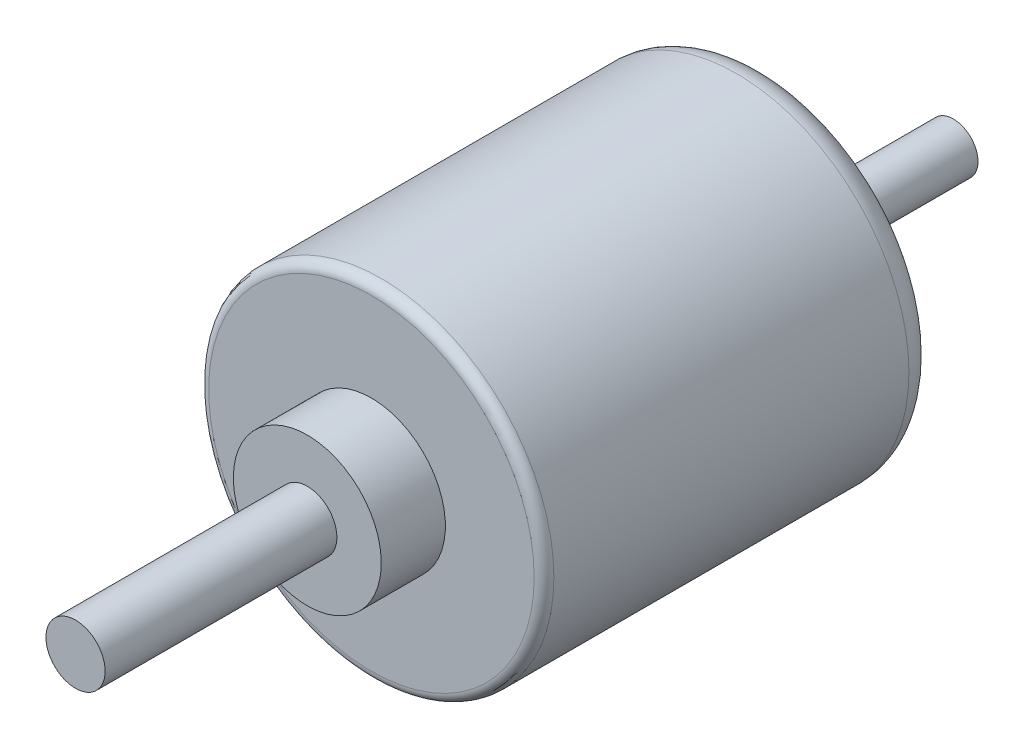
ISO-10303-21;
HEADER;
FILE_DESCRIPTION(('STEP AP214'),'2;1');
FILE_NAME('part.step','',(''),(''),'','','');
FILE_SCHEMA(('AUTOMOTIVE_DESIGN { 1 0 10303 214 1 1 1 1 }'));
ENDSEC;
DATA;
#1=APPLICATION_CONTEXT('core data for automotive mechanical design processes');
#2=APPLICATION_PROTOCOL_DEFINITION('international standard','automotive_design',2000,#1);
#3=PRODUCT_CONTEXT('',#1,'mechanical');
#4=PRODUCT('Part','Part','',(#3));
#5=PRODUCT_RELATED_PRODUCT_CATEGORY('part','',(#4));
#6=PRODUCT_DEFINITION_FORMATION('','',#4);
#7=PRODUCT_DEFINITION_CONTEXT('part definition',#1,'design');
#8=PRODUCT_DEFINITION('design','',#6,#7);
#9=PRODUCT_DEFINITION_SHAPE('','',#8);
#10=(LENGTH_UNIT() NAMED_UNIT(*) SI_UNIT(.MILLI.,.METRE.));
#11=(NAMED_UNIT(*) PLANE_ANGLE_UNIT() SI_UNIT($,.RADIAN.));
#12=(NAMED_UNIT(*) SI_UNIT($,.STERADIAN.) SOLID_ANGLE_UNIT());
#13=UNCERTAINTY_MEASURE_WITH_UNIT(LENGTH_MEASURE(1.E-05),#10,'distance_accuracy_value','');
#14=(GEOMETRIC_REPRESENTATION_CONTEXT(3) GLOBAL_UNCERTAINTY_ASSIGNED_CONTEXT((#13)) GLOBAL_UNIT_ASSIGNED_CONTEXT((#10,
#11,#12)) REPRESENTATION_CONTEXT('',''));
#15=CARTESIAN_POINT('',(0.,0.,0.));
#16=DIRECTION('',(0.,0.,1.));
#17=DIRECTION('',(1.,0.,0.));
#18=AXIS2_PLACEMENT_3D('',#15,#16,#17);
#19=CARTESIAN_POINT('',(0.,0.,40.));
#20=DIRECTION('',(0.,0.,-1.));
#21=DIRECTION('',(-1.,0.,0.));
#22=AXIS2_PLACEMENT_3D('',#19,#20,#21);
#23=CYLINDRICAL_SURFACE('',#22,17.5);
#24=CARTESIAN_POINT('',(0.,0.,3.));
#25=DIRECTION('',(0.,0.,1.));
#26=DIRECTION('',(1.,0.,0.));
#27=AXIS2_PLACEMENT_3D('',#24,#25,#26);
#28=CIRCLE('',#27,17.5);
#29=CARTESIAN_POINT('',(17.5,0.,3.));
#30=VERTEX_POINT('',#29);
#31=EDGE_CURVE('E39',#30,#30,#28,.T.);
#32=ORIENTED_EDGE('',*,*,#31,.T.);
#33=EDGE_LOOP('',(#32));
#34=FACE_BOUND('',#33,.T.);
#35=CARTESIAN_POINT('',(0.,0.,39.));
#36=DIRECTION('',(0.,0.,1.));
#37=DIRECTION('',(1.,0.,0.));
#38=AXIS2_PLACEMENT_3D('',#35,#36,#37);
#39=CIRCLE('',#38,17.5);
#40=CARTESIAN_POINT('',(17.5,0.,39.));
#41=VERTEX_POINT('',#40);
#42=EDGE_CURVE('E43',#41,#41,#39,.F.);
#43=ORIENTED_EDGE('',*,*,#42,.T.);
#44=EDGE_LOOP('',(#43));
#45=FACE_BOUND('',#44,.T.);
#46=ADVANCED_FACE('F32',(#34,#45),#23,.T.);
#47=CARTESIAN_POINT('',(0.,0.,40.));
#48=DIRECTION('',(0.,0.,1.));
#49=DIRECTION('',(1.,0.,0.));
#50=AXIS2_PLACEMENT_3D('',#47,#48,#49);
#51=PLANE('',#50);
#52=CARTESIAN_POINT('',(0.,0.,40.));
#53=DIRECTION('',(0.,0.,1.));
#54=DIRECTION('',(1.,0.,0.));
#55=AXIS2_PLACEMENT_3D('',#52,#53,#54);
#56=CIRCLE('',#55,16.5);
#57=CARTESIAN_POINT('',(16.5,0.,40.));
#58=VERTEX_POINT('',#57);
#59=EDGE_CURVE('E47',#58,#58,#56,.T.);
#60=ORIENTED_EDGE('',*,*,#59,.T.);
#61=EDGE_LOOP('',(#60));
#62=FACE_BOUND('',#61,.T.);
#63=CARTESIAN_POINT('',(0.,0.,40.));
#64=DIRECTION('',(0.,0.,1.));
#65=DIRECTION('',(1.,0.,0.));
#66=AXIS2_PLACEMENT_3D('',#63,#64,#65);
#67=CIRCLE('',#66,7.5);
#68=CARTESIAN_POINT('',(-7.5,0.,40.));
#69=VERTEX_POINT('',#68);
#70=EDGE_CURVE('E56',#69,#69,#67,.F.);
#71=ORIENTED_EDGE('',*,*,#70,.T.);
#72=EDGE_LOOP('',(#71));
#73=FACE_BOUND('',#72,.T.);
#74=ADVANCED_FACE('F91',(#62,#73),#51,.T.);
#75=CARTESIAN_POINT('',(0.,0.,0.));
#76=DIRECTION('',(0.,0.,1.));
#77=DIRECTION('',(1.,0.,0.));
#78=AXIS2_PLACEMENT_3D('',#75,#76,#77);
#79=PLANE('',#78);
#80=CARTESIAN_POINT('',(0.,0.,0.));
#81=DIRECTION('',(0.,0.,1.));
#82=DIRECTION('',(1.,0.,0.));
#83=AXIS2_PLACEMENT_3D('',#80,#81,#82);
#84=CIRCLE('',#83,14.5);
#85=CARTESIAN_POINT('',(14.5,0.,0.));
#86=VERTEX_POINT('',#85);
#87=EDGE_CURVE('E10',#86,#86,#84,.F.);
#88=ORIENTED_EDGE('',*,*,#87,.T.);
#89=EDGE_LOOP('',(#88));
#90=FACE_BOUND('',#89,.T.);
#91=CARTESIAN_POINT('',(0.,0.,0.));
#92=DIRECTION('',(0.,0.,1.));
#93=DIRECTION('',(1.,0.,0.));
#94=AXIS2_PLACEMENT_3D('',#91,#92,#93);
#95=CIRCLE('',#94,2.5);
#96=CARTESIAN_POINT('',(2.5,0.,0.));
#97=VERTEX_POINT('',#96);
#98=EDGE_CURVE('E58',#97,#97,#95,.T.);
#99=ORIENTED_EDGE('',*,*,#98,.T.);
#100=EDGE_LOOP('',(#99));
#101=FACE_BOUND('',#100,.T.);
#102=ADVANCED_FACE('F96',(#90,#101),#79,.F.);
#103=CARTESIAN_POINT('',(0.,0.,-19.));
#104=DIRECTION('',(0.,0.,1.));
#105=DIRECTION('',(1.,0.,0.));
#106=AXIS2_PLACEMENT_3D('',#103,#104,#105);
#107=CYLINDRICAL_SURFACE('',#106,2.5);
#108=CARTESIAN_POINT('',(0.,0.,-19.));
#109=DIRECTION('',(0.,0.,1.));
#110=DIRECTION('',(1.,0.,0.));
#111=AXIS2_PLACEMENT_3D('',#108,#109,#110);
#112=CIRCLE('',#111,2.5);
#113=CARTESIAN_POINT('',(2.5,0.,-19.));
#114=VERTEX_POINT('',#113);
#115=EDGE_CURVE('E52',#114,#114,#112,.T.);
#116=ORIENTED_EDGE('',*,*,#115,.T.);
#117=EDGE_LOOP('',(#116));
#118=FACE_BOUND('',#117,.T.);
#119=ORIENTED_EDGE('',*,*,#98,.F.);
#120=EDGE_LOOP('',(#119));
#121=FACE_BOUND('',#120,.T.);
#122=ADVANCED_FACE('F85',(#118,#121),#107,.T.);
#123=CARTESIAN_POINT('',(0.,0.,-19.));
#124=DIRECTION('',(0.,0.,1.));
#125=DIRECTION('',(1.,0.,0.));
#126=AXIS2_PLACEMENT_3D('',#123,#124,#125);
#127=PLANE('',#126);
#128=ORIENTED_EDGE('',*,*,#115,.F.);
#129=EDGE_LOOP('',(#128));
#130=FACE_BOUND('',#129,.T.);
#131=ADVANCED_FACE('F75',(#130),#127,.F.);
#132=CARTESIAN_POINT('',(0.,0.,46.5));
#133=DIRECTION('',(0.,0.,-1.));
#134=DIRECTION('',(-1.,0.,0.));
#135=AXIS2_PLACEMENT_3D('',#132,#133,#134);
#136=CYLINDRICAL_SURFACE('',#135,7.5);
#137=CARTESIAN_POINT('',(0.,0.,46.5));
#138=DIRECTION('',(0.,0.,1.));
#139=DIRECTION('',(1.,0.,0.));
#140=AXIS2_PLACEMENT_3D('',#137,#138,#139);
#141=CIRCLE('',#140,7.5);
#142=CARTESIAN_POINT('',(-7.5,0.,46.5));
#143=VERTEX_POINT('',#142);
#144=EDGE_CURVE('E57',#143,#143,#141,.T.);
#145=CARTESIAN_POINT('',(-7.5,0.,40.));
#146=CARTESIAN_POINT('',(-7.5,0.,40.0677083333333));
#147=CARTESIAN_POINT('',(-7.5,0.,40.1354166666667));
#148=CARTESIAN_POINT('',(-7.5,0.,40.2708333333333));
#149=CARTESIAN_POINT('',(-7.5,0.,40.3385416666667));
#150=CARTESIAN_POINT('',(-7.5,0.,40.4739583333333));
#151=CARTESIAN_POINT('',(-7.5,0.,40.5416666666667));
#152=CARTESIAN_POINT('',(-7.5,0.,40.6770833333333));
#153=CARTESIAN_POINT('',(-7.5,0.,40.7447916666667));
#154=CARTESIAN_POINT('',(-7.5,0.,40.8802083333333));
#155=CARTESIAN_POINT('',(-7.5,0.,40.9479166666667));
#156=CARTESIAN_POINT('',(-7.5,0.,41.0833333333333));
#157=CARTESIAN_POINT('',(-7.5,0.,41.1510416666667));
#158=CARTESIAN_POINT('',(-7.5,0.,41.2864583333333));
#159=CARTESIAN_POINT('',(-7.5,0.,41.3541666666667));
#160=CARTESIAN_POINT('',(-7.5,0.,41.4895833333333));
#161=CARTESIAN_POINT('',(-7.5,0.,41.5572916666667));
#162=CARTESIAN_POINT('',(-7.5,0.,41.6927083333333));
#163=CARTESIAN_POINT('',(-7.5,0.,41.7604166666667));
#164=CARTESIAN_POINT('',(-7.5,0.,41.8958333333333));
#165=CARTESIAN_POINT('',(-7.5,0.,41.9635416666667));
#166=CARTESIAN_POINT('',(-7.5,0.,42.0989583333333));
#167=CARTESIAN_POINT('',(-7.5,0.,42.1666666666667));
#168=CARTESIAN_POINT('',(-7.5,0.,42.3020833333333));
#169=CARTESIAN_POINT('',(-7.5,0.,42.3697916666667));
#170=CARTESIAN_POINT('',(-7.5,0.,42.5052083333333));
#171=CARTESIAN_POINT('',(-7.5,0.,42.5729166666667));
#172=CARTESIAN_POINT('',(-7.5,0.,42.7083333333333));
#173=CARTESIAN_POINT('',(-7.5,0.,42.7760416666667));
#174=CARTESIAN_POINT('',(-7.5,0.,42.9114583333333));
#175=CARTESIAN_POINT('',(-7.5,0.,42.9791666666667));
#176=CARTESIAN_POINT('',(-7.5,0.,43.1145833333333));
#177=CARTESIAN_POINT('',(-7.5,0.,43.1822916666667));
#178=CARTESIAN_POINT('',(-7.5,0.,43.3177083333333));
#179=CARTESIAN_POINT('',(-7.5,0.,43.3854166666667));
#180=CARTESIAN_POINT('',(-7.5,0.,43.5208333333333));
#181=CARTESIAN_POINT('',(-7.5,0.,43.5885416666667));
#182=CARTESIAN_POINT('',(-7.5,0.,43.7239583333333));
#183=CARTESIAN_POINT('',(-7.5,0.,43.7916666666667));
#184=CARTESIAN_POINT('',(-7.5,0.,43.9270833333333));
#185=CARTESIAN_POINT('',(-7.5,0.,43.9947916666667));
#186=CARTESIAN_POINT('',(-7.5,0.,44.1302083333333));
#187=CARTESIAN_POINT('',(-7.5,0.,44.1979166666667));
#188=CARTESIAN_POINT('',(-7.5,0.,44.3333333333333));
#189=CARTESIAN_POINT('',(-7.5,0.,44.4010416666667));
#190=CARTESIAN_POINT('',(-7.5,0.,44.5364583333333));
#191=CARTESIAN_POINT('',(-7.5,0.,44.6041666666667));
#192=CARTESIAN_POINT('',(-7.5,0.,44.7395833333333));
#193=CARTESIAN_POINT('',(-7.5,0.,44.8072916666667));
#194=CARTESIAN_POINT('',(-7.5,0.,44.9427083333333));
#195=CARTESIAN_POINT('',(-7.5,0.,45.0104166666667));
#196=CARTESIAN_POINT('',(-7.5,0.,45.1458333333333));
#197=CARTESIAN_POINT('',(-7.5,0.,45.2135416666667));
#198=CARTESIAN_POINT('',(-7.5,0.,45.3489583333333));
#199=CARTESIAN_POINT('',(-7.5,0.,45.4166666666667));
#200=CARTESIAN_POINT('',(-7.5,0.,45.5520833333333));
#201=CARTESIAN_POINT('',(-7.5,0.,45.6197916666667));
#202=CARTESIAN_POINT('',(-7.5,0.,45.7552083333333));
#203=CARTESIAN_POINT('',(-7.5,0.,45.8229166666667));
#204=CARTESIAN_POINT('',(-7.5,0.,45.9583333333333));
#205=CARTESIAN_POINT('',(-7.5,0.,46.0260416666667));
#206=CARTESIAN_POINT('',(-7.5,0.,46.1614583333333));
#207=CARTESIAN_POINT('',(-7.5,0.,46.2291666666667));
#208=CARTESIAN_POINT('',(-7.5,0.,46.3645833333333));
#209=CARTESIAN_POINT('',(-7.5,0.,46.4322916666667));
#210=CARTESIAN_POINT('',(-7.5,0.,46.5));
#211=B_SPLINE_CURVE_WITH_KNOTS('',3,(#145,#146,#147,#148,#149,#150,#151,#152,#153,#154,#155,
#156,#157,#158,#159,#160,#161,#162,#163,#164,#165,#166,#167,#168,#169,#170,#171,#172,#173,#174,
#175,#176,#177,#178,#179,#180,#181,#182,#183,#184,#185,#186,#187,#188,#189,#190,#191,#192,#193,
#194,#195,#196,#197,#198,#199,#200,#201,#202,#203,#204,#205,#206,#207,#208,#209,#210),
.UNSPECIFIED.,.F.,.F.,(4,2,2,2,2,2,2,2,2,2,2,2,2,2,2,2,2,2,2,2,2,2,2,2,2,2,2,2,2,2,2,2,4),(0.,
0.203124999999998,0.406249999999997,0.609374999999995,0.812500000000001,1.015625,1.21875,
1.421875,1.62499999999999,1.828125,2.03125,2.234375,2.4375,2.64062499999999,2.84375,3.046875,
3.25,3.45312499999999,3.65624999999999,3.859375,4.0625,4.26562499999999,4.46874999999999,
4.671875,4.875,5.078125,5.28124999999999,5.48437499999999,5.6875,5.890625,6.09374999999999,
6.29687499999999,6.5),.UNSPECIFIED.);
#212=EDGE_CURVE('BSEAM73',#69,#143,#211,.T.);
#213=ORIENTED_EDGE('',*,*,#70,.F.);
#214=ORIENTED_EDGE('',*,*,#144,.F.);
#215=ORIENTED_EDGE('',*,*,#212,.T.);
#216=ORIENTED_EDGE('',*,*,#212,.F.);
#217=EDGE_LOOP('',(#213,#215,#214,#216));
#218=FACE_BOUND('',#217,.T.);
#219=ADVANCED_FACE('F73',(#218),#136,.T.);
#220=CARTESIAN_POINT('',(0.,0.,46.5));
#221=DIRECTION('',(0.,0.,1.));
#222=DIRECTION('',(1.,0.,0.));
#223=AXIS2_PLACEMENT_3D('',#220,#221,#222);
#224=PLANE('',#223);
#225=CARTESIAN_POINT('',(0.,0.,46.5));
#226=DIRECTION('',(0.,0.,1.));
#227=DIRECTION('',(1.,0.,0.));
#228=AXIS2_PLACEMENT_3D('',#225,#226,#227);
#229=CIRCLE('',#228,3.);
#230=CARTESIAN_POINT('',(3.,0.,46.5));
#231=VERTEX_POINT('',#230);
#232=EDGE_CURVE('E53',#231,#231,#229,.T.);
#233=ORIENTED_EDGE('',*,*,#232,.F.);
#234=EDGE_LOOP('',(#233));
#235=FACE_BOUND('',#234,.T.);
#236=ORIENTED_EDGE('',*,*,#144,.T.);
#237=EDGE_LOOP('',(#236));
#238=FACE_BOUND('',#237,.T.);
#239=ADVANCED_FACE('F71',(#235,#238),#224,.T.);
#240=CARTESIAN_POINT('',(0.,0.,70.));
#241=DIRECTION('',(0.,0.,1.));
#242=DIRECTION('',(1.,0.,0.));
#243=AXIS2_PLACEMENT_3D('',#240,#241,#242);
#244=PLANE('',#243);
#245=CARTESIAN_POINT('',(0.,0.,70.));
#246=DIRECTION('',(0.,0.,1.));
#247=DIRECTION('',(1.,0.,0.));
#248=AXIS2_PLACEMENT_3D('',#245,#246,#247);
#249=CIRCLE('',#248,3.);
#250=CARTESIAN_POINT('',(3.,0.,70.));
#251=VERTEX_POINT('',#250);
#252=EDGE_CURVE('E61',#251,#251,#249,.T.);
#253=ORIENTED_EDGE('',*,*,#252,.T.);
#254=EDGE_LOOP('',(#253));
#255=FACE_BOUND('',#254,.T.);
#256=ADVANCED_FACE('F82',(#255),#244,.T.);
#257=CARTESIAN_POINT('',(0.,0.,70.));
#258=DIRECTION('',(0.,0.,-1.));
#259=DIRECTION('',(-1.,0.,0.));
#260=AXIS2_PLACEMENT_3D('',#257,#258,#259);
#261=CYLINDRICAL_SURFACE('',#260,3.);
#262=ORIENTED_EDGE('',*,*,#232,.T.);
#263=EDGE_LOOP('',(#262));
#264=FACE_BOUND('',#263,.T.);
#265=ORIENTED_EDGE('',*,*,#252,.F.);
#266=EDGE_LOOP('',(#265));
#267=FACE_BOUND('',#266,.T.);
#268=ADVANCED_FACE('F103',(#264,#267),#261,.T.);
#269=CARTESIAN_POINT('',(0.,0.,39.));
#270=DIRECTION('',(0.,0.,1.));
#271=DIRECTION('',(1.,0.,0.));
#272=AXIS2_PLACEMENT_3D('',#269,#270,#271);
#273=TOROIDAL_SURFACE('',#272,16.5,1.);
#274=ORIENTED_EDGE('',*,*,#42,.F.);
#275=EDGE_LOOP('',(#274));
#276=FACE_BOUND('',#275,.T.);
#277=ORIENTED_EDGE('',*,*,#59,.F.);
#278=EDGE_LOOP('',(#277));
#279=FACE_BOUND('',#278,.T.);
#280=ADVANCED_FACE('F101',(#276,#279),#273,.T.);
#281=CARTESIAN_POINT('',(0.,0.,3.));
#282=DIRECTION('',(0.,0.,1.));
#283=DIRECTION('',(1.,0.,0.));
#284=AXIS2_PLACEMENT_3D('',#281,#282,#283);
#285=TOROIDAL_SURFACE('',#284,14.5,3.);
#286=ORIENTED_EDGE('',*,*,#87,.F.);
#287=EDGE_LOOP('',(#286));
#288=FACE_BOUND('',#287,.T.);
#289=ORIENTED_EDGE('',*,*,#31,.F.);
#290=EDGE_LOOP('',(#289));
#291=FACE_BOUND('',#290,.T.);
#292=ADVANCED_FACE('F34',(#288,#291),#285,.T.);
#293=CLOSED_SHELL('',(#46,#74,#102,#122,#131,#219,#239,#256,#268,#280,#292));
#294=MANIFOLD_SOLID_BREP('B2',#293);
#295=ADVANCED_BREP_SHAPE_REPRESENTATION('',(#18,#294),#14);
#296=SHAPE_DEFINITION_REPRESENTATION(#9,#295);
ENDSEC;
END-ISO-10303-21;
